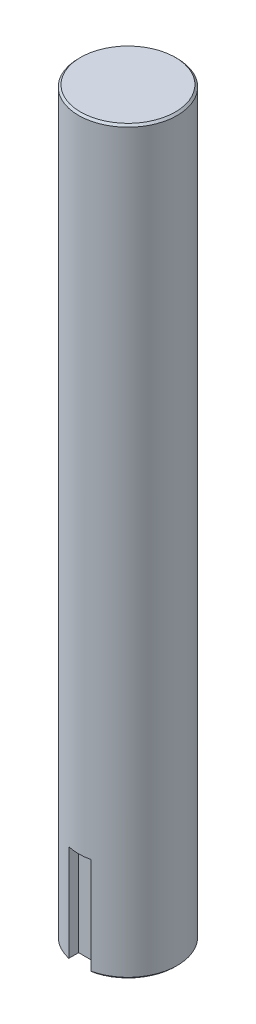
ISO-10303-21;
HEADER;
FILE_DESCRIPTION(('STEP AP214'),'2;1');
FILE_NAME('part.step','',(''),(''),'','','');
FILE_SCHEMA(('AUTOMOTIVE_DESIGN { 1 0 10303 214 1 1 1 1 }'));
ENDSEC;
DATA;
#1=APPLICATION_CONTEXT('core data for automotive mechanical design processes');
#2=APPLICATION_PROTOCOL_DEFINITION('international standard','automotive_design',2000,#1);
#3=PRODUCT_CONTEXT('',#1,'mechanical');
#4=PRODUCT('Part','Part','',(#3));
#5=PRODUCT_RELATED_PRODUCT_CATEGORY('part','',(#4));
#6=PRODUCT_DEFINITION_FORMATION('','',#4);
#7=PRODUCT_DEFINITION_CONTEXT('part definition',#1,'design');
#8=PRODUCT_DEFINITION('design','',#6,#7);
#9=PRODUCT_DEFINITION_SHAPE('','',#8);
#10=(LENGTH_UNIT() NAMED_UNIT(*) SI_UNIT(.MILLI.,.METRE.));
#11=(NAMED_UNIT(*) PLANE_ANGLE_UNIT() SI_UNIT($,.RADIAN.));
#12=(NAMED_UNIT(*) SI_UNIT($,.STERADIAN.) SOLID_ANGLE_UNIT());
#13=UNCERTAINTY_MEASURE_WITH_UNIT(LENGTH_MEASURE(1.E-05),#10,'distance_accuracy_value','');
#14=(GEOMETRIC_REPRESENTATION_CONTEXT(3) GLOBAL_UNCERTAINTY_ASSIGNED_CONTEXT((#13)) GLOBAL_UNIT_ASSIGNED_CONTEXT((#10,
#11,#12)) REPRESENTATION_CONTEXT('',''));
#15=CARTESIAN_POINT('',(0.,0.,0.));
#16=DIRECTION('',(0.,0.,1.));
#17=DIRECTION('',(1.,0.,0.));
#18=AXIS2_PLACEMENT_3D('',#15,#16,#17);
#19=CARTESIAN_POINT('',(4.99999999999999,75.,0.));
#20=DIRECTION('',(0.,-1.,0.));
#21=DIRECTION('',(1.,0.,0.));
#22=AXIS2_PLACEMENT_3D('',#19,#20,#21);
#23=PLANE('',#22);
#24=CARTESIAN_POINT('',(0.,75.,0.));
#25=DIRECTION('',(0.,-1.,0.));
#26=DIRECTION('',(1.,0.,0.));
#27=AXIS2_PLACEMENT_3D('',#24,#25,#26);
#28=CIRCLE('',#27,4.79999999999998);
#29=CARTESIAN_POINT('',(4.79999999999998,75.,0.));
#30=VERTEX_POINT('',#29);
#31=EDGE_CURVE('E119',#30,#30,#28,.F.);
#32=ORIENTED_EDGE('',*,*,#31,.T.);
#33=EDGE_LOOP('',(#32));
#34=FACE_BOUND('',#33,.T.);
#35=ADVANCED_FACE('F33',(#34),#23,.F.);
#36=CARTESIAN_POINT('',(0.,75.,0.));
#37=DIRECTION('',(0.,1.,0.));
#38=DIRECTION('',(-1.,0.,0.));
#39=AXIS2_PLACEMENT_3D('',#36,#37,#38);
#40=CYLINDRICAL_SURFACE('',#39,5.);
#41=CARTESIAN_POINT('',(0.,74.8,0.));
#42=DIRECTION('',(0.,-1.,0.));
#43=DIRECTION('',(1.,0.,0.));
#44=AXIS2_PLACEMENT_3D('',#41,#42,#43);
#45=CIRCLE('',#44,5.);
#46=CARTESIAN_POINT('',(5.,74.8,0.));
#47=VERTEX_POINT('',#46);
#48=EDGE_CURVE('E124',#47,#47,#45,.T.);
#49=ORIENTED_EDGE('',*,*,#48,.T.);
#50=EDGE_LOOP('',(#49));
#51=FACE_BOUND('',#50,.T.);
#52=DIRECTION('',(0.,1.,0.));
#53=VECTOR('',#52,1.);
#54=CARTESIAN_POINT('',(1.125,75.,4.87179381747627));
#55=LINE('',#54,#53);
#56=CARTESIAN_POINT('',(1.125,9.99999999999999,4.87179381747627));
#57=VERTEX_POINT('',#56);
#58=CARTESIAN_POINT('',(1.125,0.200000000000006,4.87179381747627));
#59=VERTEX_POINT('',#58);
#60=EDGE_CURVE('E115',#57,#59,#55,.F.);
#61=ORIENTED_EDGE('',*,*,#60,.T.);
#62=CARTESIAN_POINT('',(0.,0.200000000000006,0.));
#63=DIRECTION('',(0.,1.,0.));
#64=DIRECTION('',(-1.,0.,0.));
#65=AXIS2_PLACEMENT_3D('',#62,#63,#64);
#66=CIRCLE('',#65,5.);
#67=CARTESIAN_POINT('',(-1.125,0.200000000000006,4.87179381747627));
#68=VERTEX_POINT('',#67);
#69=EDGE_CURVE('E122',#59,#68,#66,.T.);
#70=ORIENTED_EDGE('',*,*,#69,.T.);
#71=DIRECTION('',(0.,1.,0.));
#72=VECTOR('',#71,1.);
#73=CARTESIAN_POINT('',(-1.125,75.,4.87179381747627));
#74=LINE('',#73,#72);
#75=CARTESIAN_POINT('',(-1.125,9.99999999999999,4.87179381747627));
#76=VERTEX_POINT('',#75);
#77=EDGE_CURVE('E112',#68,#76,#74,.T.);
#78=ORIENTED_EDGE('',*,*,#77,.T.);
#79=CARTESIAN_POINT('',(0.,9.99999999999999,0.));
#80=DIRECTION('',(0.,-1.,0.));
#81=DIRECTION('',(1.,0.,0.));
#82=AXIS2_PLACEMENT_3D('',#79,#80,#81);
#83=CIRCLE('',#82,5.);
#84=EDGE_CURVE('E96',#57,#76,#83,.T.);
#85=ORIENTED_EDGE('',*,*,#84,.F.);
#86=EDGE_LOOP('',(#61,#70,#78,#85));
#87=FACE_BOUND('',#86,.T.);
#88=ADVANCED_FACE('F171',(#51,#87),#40,.T.);
#89=CARTESIAN_POINT('',(5.,0.,0.));
#90=DIRECTION('',(0.,1.,0.));
#91=DIRECTION('',(-1.,0.,0.));
#92=AXIS2_PLACEMENT_3D('',#89,#90,#91);
#93=PLANE('',#92);
#94=DIRECTION('',(-1.,0.,0.));
#95=VECTOR('',#94,1.);
#96=CARTESIAN_POINT('',(5.,0.,3.67499999999999));
#97=LINE('',#96,#95);
#98=CARTESIAN_POINT('',(1.32500000000001,0.,3.67499999999999));
#99=VERTEX_POINT('',#98);
#100=CARTESIAN_POINT('',(-1.32500000000001,0.,3.67499999999999));
#101=VERTEX_POINT('',#100);
#102=EDGE_CURVE('E131',#99,#101,#97,.T.);
#103=ORIENTED_EDGE('',*,*,#102,.T.);
#104=DIRECTION('',(0.,0.,1.));
#105=VECTOR('',#104,1.);
#106=CARTESIAN_POINT('',(-1.32500000000001,0.,0.));
#107=LINE('',#106,#105);
#108=CARTESIAN_POINT('',(-1.32500000000001,0.,4.61349921426241));
#109=VERTEX_POINT('',#108);
#110=EDGE_CURVE('E133',#101,#109,#107,.T.);
#111=ORIENTED_EDGE('',*,*,#110,.T.);
#112=CARTESIAN_POINT('',(0.,0.,0.));
#113=DIRECTION('',(0.,1.,0.));
#114=DIRECTION('',(-1.,0.,0.));
#115=AXIS2_PLACEMENT_3D('',#112,#113,#114);
#116=CIRCLE('',#115,4.79999999999999);
#117=CARTESIAN_POINT('',(1.325,0.,4.61349921426241));
#118=VERTEX_POINT('',#117);
#119=EDGE_CURVE('E127',#109,#118,#116,.F.);
#120=ORIENTED_EDGE('',*,*,#119,.T.);
#121=DIRECTION('',(0.,0.,-1.));
#122=VECTOR('',#121,1.);
#123=CARTESIAN_POINT('',(1.32500000000001,0.,0.));
#124=LINE('',#123,#122);
#125=EDGE_CURVE('E129',#118,#99,#124,.T.);
#126=ORIENTED_EDGE('',*,*,#125,.T.);
#127=EDGE_LOOP('',(#103,#111,#120,#126));
#128=FACE_BOUND('',#127,.T.);
#129=ADVANCED_FACE('F175',(#128),#93,.F.);
#130=CARTESIAN_POINT('',(0.,10.,0.));
#131=DIRECTION('',(0.,-1.,0.));
#132=DIRECTION('',(1.,0.,0.));
#133=AXIS2_PLACEMENT_3D('',#130,#131,#132);
#134=PLANE('',#133);
#135=ORIENTED_EDGE('',*,*,#84,.T.);
#136=DIRECTION('',(0.,0.,-1.));
#137=VECTOR('',#136,1.);
#138=CARTESIAN_POINT('',(-1.125,10.,6.125));
#139=LINE('',#138,#137);
#140=CARTESIAN_POINT('',(-1.125,10.,3.875));
#141=VERTEX_POINT('',#140);
#142=EDGE_CURVE('E89',#76,#141,#139,.T.);
#143=ORIENTED_EDGE('',*,*,#142,.T.);
#144=DIRECTION('',(1.,0.,0.));
#145=VECTOR('',#144,1.);
#146=CARTESIAN_POINT('',(-1.125,10.,3.875));
#147=LINE('',#146,#145);
#148=CARTESIAN_POINT('',(1.125,10.,3.875));
#149=VERTEX_POINT('',#148);
#150=EDGE_CURVE('E94',#141,#149,#147,.T.);
#151=ORIENTED_EDGE('',*,*,#150,.T.);
#152=DIRECTION('',(0.,0.,1.));
#153=VECTOR('',#152,1.);
#154=CARTESIAN_POINT('',(1.125,10.,6.125));
#155=LINE('',#154,#153);
#156=EDGE_CURVE('E99',#149,#57,#155,.T.);
#157=ORIENTED_EDGE('',*,*,#156,.T.);
#158=EDGE_LOOP('',(#135,#143,#151,#157));
#159=FACE_BOUND('',#158,.T.);
#160=ADVANCED_FACE('F91',(#159),#134,.T.);
#161=CARTESIAN_POINT('',(1.125,10.,6.125));
#162=DIRECTION('',(1.,0.,0.));
#163=DIRECTION('',(0.,0.,-1.));
#164=AXIS2_PLACEMENT_3D('',#161,#162,#163);
#165=PLANE('',#164);
#166=DIRECTION('',(0.,-1.,0.));
#167=VECTOR('',#166,1.);
#168=CARTESIAN_POINT('',(1.125,10.,3.875));
#169=LINE('',#168,#167);
#170=CARTESIAN_POINT('',(1.125,0.200000000000002,3.875));
#171=VERTEX_POINT('',#170);
#172=EDGE_CURVE('E105',#149,#171,#169,.T.);
#173=ORIENTED_EDGE('',*,*,#172,.T.);
#174=DIRECTION('',(0.,0.,1.));
#175=VECTOR('',#174,1.);
#176=CARTESIAN_POINT('',(1.125,0.200000000000002,6.125));
#177=LINE('',#176,#175);
#178=EDGE_CURVE('E11',#171,#59,#177,.T.);
#179=ORIENTED_EDGE('',*,*,#178,.T.);
#180=ORIENTED_EDGE('',*,*,#60,.F.);
#181=ORIENTED_EDGE('',*,*,#156,.F.);
#182=EDGE_LOOP('',(#173,#179,#180,#181));
#183=FACE_BOUND('',#182,.T.);
#184=ADVANCED_FACE('F201',(#183),#165,.F.);
#185=CARTESIAN_POINT('',(-1.125,10.,6.125));
#186=DIRECTION('',(-1.,0.,0.));
#187=DIRECTION('',(0.,0.,1.));
#188=AXIS2_PLACEMENT_3D('',#185,#186,#187);
#189=PLANE('',#188);
#190=ORIENTED_EDGE('',*,*,#77,.F.);
#191=DIRECTION('',(0.,0.,-1.));
#192=VECTOR('',#191,1.);
#193=CARTESIAN_POINT('',(-1.125,0.200000000000002,6.125));
#194=LINE('',#193,#192);
#195=CARTESIAN_POINT('',(-1.125,0.200000000000002,3.875));
#196=VERTEX_POINT('',#195);
#197=EDGE_CURVE('E104',#68,#196,#194,.T.);
#198=ORIENTED_EDGE('',*,*,#197,.T.);
#199=DIRECTION('',(0.,-1.,0.));
#200=VECTOR('',#199,1.);
#201=CARTESIAN_POINT('',(-1.125,10.,3.875));
#202=LINE('',#201,#200);
#203=EDGE_CURVE('E102',#141,#196,#202,.T.);
#204=ORIENTED_EDGE('',*,*,#203,.F.);
#205=ORIENTED_EDGE('',*,*,#142,.F.);
#206=EDGE_LOOP('',(#190,#198,#204,#205));
#207=FACE_BOUND('',#206,.T.);
#208=ADVANCED_FACE('F103',(#207),#189,.F.);
#209=CARTESIAN_POINT('',(-1.125,10.,3.875));
#210=DIRECTION('',(0.,0.,-1.));
#211=DIRECTION('',(-1.,0.,0.));
#212=AXIS2_PLACEMENT_3D('',#209,#210,#211);
#213=PLANE('',#212);
#214=ORIENTED_EDGE('',*,*,#203,.T.);
#215=DIRECTION('',(1.,0.,0.));
#216=VECTOR('',#215,1.);
#217=CARTESIAN_POINT('',(-1.125,0.200000000000002,3.875));
#218=LINE('',#217,#216);
#219=EDGE_CURVE('E42',#196,#171,#218,.T.);
#220=ORIENTED_EDGE('',*,*,#219,.T.);
#221=ORIENTED_EDGE('',*,*,#172,.F.);
#222=ORIENTED_EDGE('',*,*,#150,.F.);
#223=EDGE_LOOP('',(#214,#220,#221,#222));
#224=FACE_BOUND('',#223,.T.);
#225=ADVANCED_FACE('F107',(#224),#213,.F.);
#226=CARTESIAN_POINT('',(0.,75.,0.));
#227=DIRECTION('',(0.,-1.,0.));
#228=DIRECTION('',(1.,0.,0.));
#229=AXIS2_PLACEMENT_3D('',#226,#227,#228);
#230=CONICAL_SURFACE('',#229,4.79999999999998,0.785398163397466);
#231=ORIENTED_EDGE('',*,*,#48,.F.);
#232=EDGE_LOOP('',(#231));
#233=FACE_BOUND('',#232,.T.);
#234=ORIENTED_EDGE('',*,*,#31,.F.);
#235=EDGE_LOOP('',(#234));
#236=FACE_BOUND('',#235,.T.);
#237=ADVANCED_FACE('F154',(#233,#236),#230,.T.);
#238=CARTESIAN_POINT('',(1.125,0.200000000000002,6.125));
#239=DIRECTION('',(0.707106781186542,0.707106781186553,0.));
#240=DIRECTION('',(0.,0.,1.));
#241=AXIS2_PLACEMENT_3D('',#238,#239,#240);
#242=PLANE('',#241);
#243=CARTESIAN_POINT('',(1.125,0.200000000000004,4.87179381747627));
#244=CARTESIAN_POINT('',(1.15874603758877,0.166253962411237,4.82938392753707));
#245=CARTESIAN_POINT('',(1.19228570760569,0.13271429239431,4.78665445279524));
#246=CARTESIAN_POINT('',(1.25895237504687,0.0660476249531305,4.70055625292338));
#247=CARTESIAN_POINT('',(1.29207937169661,0.0329206283033902,4.65718752659393));
#248=CARTESIAN_POINT('',(1.325,0.,4.61349921426241));
#249=B_SPLINE_CURVE_WITH_KNOTS('',3,(#243,#244,#245,#246,#247,#248),.UNSPECIFIED.,.F.,.F.,(4,2,
4),(0.,0.191521911207603,0.383044181812163),.UNSPECIFIED.);
#250=EDGE_CURVE('E156',#59,#118,#249,.T.);
#251=ORIENTED_EDGE('',*,*,#250,.F.);
#252=ORIENTED_EDGE('',*,*,#178,.F.);
#253=DIRECTION('',(0.577350269189628,-0.57735026918962,-0.577350269189629));
#254=VECTOR('',#253,1.);
#255=CARTESIAN_POINT('',(0.374999999999993,0.949999999999998,4.62500000000001));
#256=LINE('',#255,#254);
#257=EDGE_CURVE('E37',#99,#171,#256,.F.);
#258=ORIENTED_EDGE('',*,*,#257,.F.);
#259=ORIENTED_EDGE('',*,*,#125,.F.);
#260=EDGE_LOOP('',(#251,#252,#258,#259));
#261=FACE_BOUND('',#260,.T.);
#262=ADVANCED_FACE('F151',(#261),#242,.F.);
#263=CARTESIAN_POINT('',(-1.125,0.200000000000002,3.875));
#264=DIRECTION('',(0.,0.707106781186554,-0.707106781186541));
#265=DIRECTION('',(1.,0.,0.));
#266=AXIS2_PLACEMENT_3D('',#263,#264,#265);
#267=PLANE('',#266);
#268=ORIENTED_EDGE('',*,*,#257,.T.);
#269=ORIENTED_EDGE('',*,*,#219,.F.);
#270=DIRECTION('',(-0.57735026918963,-0.577350269189619,-0.577350269189628));
#271=VECTOR('',#270,1.);
#272=CARTESIAN_POINT('',(-2.55000000000002,-1.22499999999999,2.44999999999999));
#273=LINE('',#272,#271);
#274=EDGE_CURVE('E57',#101,#196,#273,.F.);
#275=ORIENTED_EDGE('',*,*,#274,.F.);
#276=ORIENTED_EDGE('',*,*,#102,.F.);
#277=EDGE_LOOP('',(#268,#269,#275,#276));
#278=FACE_BOUND('',#277,.T.);
#279=ADVANCED_FACE('F35',(#278),#267,.F.);
#280=CARTESIAN_POINT('',(0.,0.200000000000006,0.));
#281=DIRECTION('',(0.,1.,0.));
#282=DIRECTION('',(-1.,0.,0.));
#283=AXIS2_PLACEMENT_3D('',#280,#281,#282);
#284=CONICAL_SURFACE('',#283,5.,0.785398163397448);
#285=ORIENTED_EDGE('',*,*,#250,.T.);
#286=ORIENTED_EDGE('',*,*,#119,.F.);
#287=CARTESIAN_POINT('',(-1.32500000000001,0.,4.61349921426241));
#288=CARTESIAN_POINT('',(-1.29207937169662,0.0329206283033898,4.65718752659393));
#289=CARTESIAN_POINT('',(-1.25895237504688,0.0660476249531301,4.70055625292338));
#290=CARTESIAN_POINT('',(-1.19228570760569,0.13271429239431,4.78665445279524));
#291=CARTESIAN_POINT('',(-1.15874603758877,0.166253962411237,4.82938392753707));
#292=CARTESIAN_POINT('',(-1.125,0.200000000000004,4.87179381747627));
#293=B_SPLINE_CURVE_WITH_KNOTS('',3,(#287,#288,#289,#290,#291,#292),.UNSPECIFIED.,.F.,.F.,(4,2,
4),(0.,0.191522270604562,0.383044181812165),.UNSPECIFIED.);
#294=EDGE_CURVE('E138',#68,#109,#293,.F.);
#295=ORIENTED_EDGE('',*,*,#294,.F.);
#296=ORIENTED_EDGE('',*,*,#69,.F.);
#297=EDGE_LOOP('',(#285,#286,#295,#296));
#298=FACE_BOUND('',#297,.T.);
#299=ADVANCED_FACE('F145',(#298),#284,.T.);
#300=CARTESIAN_POINT('',(-1.32500000000001,0.,0.));
#301=DIRECTION('',(-0.70710678118654,0.707106781186555,0.));
#302=DIRECTION('',(0.,0.,1.));
#303=AXIS2_PLACEMENT_3D('',#300,#301,#302);
#304=PLANE('',#303);
#305=ORIENTED_EDGE('',*,*,#274,.T.);
#306=ORIENTED_EDGE('',*,*,#197,.F.);
#307=ORIENTED_EDGE('',*,*,#294,.T.);
#308=ORIENTED_EDGE('',*,*,#110,.F.);
#309=EDGE_LOOP('',(#305,#306,#307,#308));
#310=FACE_BOUND('',#309,.T.);
#311=ADVANCED_FACE('F148',(#310),#304,.F.);
#312=CLOSED_SHELL('',(#35,#88,#129,#160,#184,#208,#225,#237,#262,#279,#299,#311));
#313=MANIFOLD_SOLID_BREP('B2',#312);
#314=ADVANCED_BREP_SHAPE_REPRESENTATION('',(#18,#313),#14);
#315=SHAPE_DEFINITION_REPRESENTATION(#9,#314);
ENDSEC;
END-ISO-10303-21;
